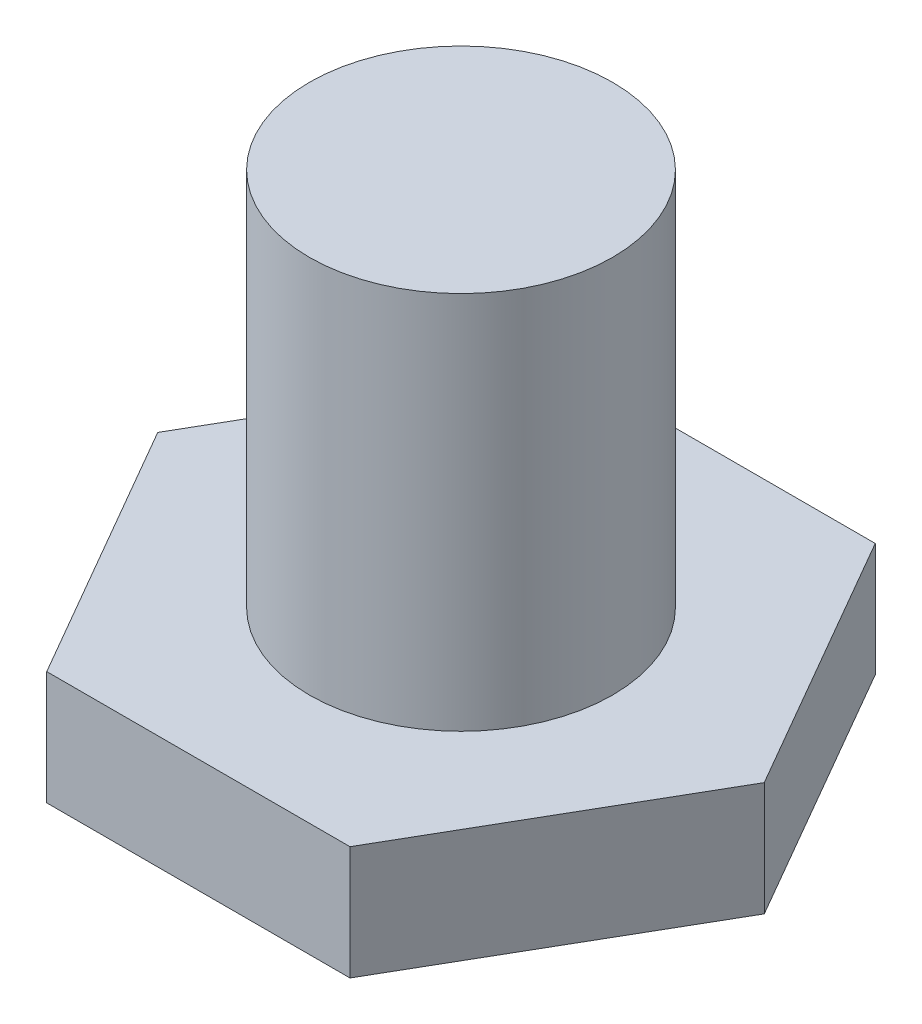
ISO-10303-21;
HEADER;
FILE_DESCRIPTION(('STEP AP214'),'2;1');
FILE_NAME('part.step','',(''),(''),'','','');
FILE_SCHEMA(('AUTOMOTIVE_DESIGN { 1 0 10303 214 1 1 1 1 }'));
ENDSEC;
DATA;
#1=APPLICATION_CONTEXT('core data for automotive mechanical design processes');
#2=APPLICATION_PROTOCOL_DEFINITION('international standard','automotive_design',2000,#1);
#3=PRODUCT_CONTEXT('',#1,'mechanical');
#4=PRODUCT('Part','Part','',(#3));
#5=PRODUCT_RELATED_PRODUCT_CATEGORY('part','',(#4));
#6=PRODUCT_DEFINITION_FORMATION('','',#4);
#7=PRODUCT_DEFINITION_CONTEXT('part definition',#1,'design');
#8=PRODUCT_DEFINITION('design','',#6,#7);
#9=PRODUCT_DEFINITION_SHAPE('','',#8);
#10=(LENGTH_UNIT() NAMED_UNIT(*) SI_UNIT(.MILLI.,.METRE.));
#11=(NAMED_UNIT(*) PLANE_ANGLE_UNIT() SI_UNIT($,.RADIAN.));
#12=(NAMED_UNIT(*) SI_UNIT($,.STERADIAN.) SOLID_ANGLE_UNIT());
#13=UNCERTAINTY_MEASURE_WITH_UNIT(LENGTH_MEASURE(1.E-05),#10,'distance_accuracy_value','');
#14=(GEOMETRIC_REPRESENTATION_CONTEXT(3) GLOBAL_UNCERTAINTY_ASSIGNED_CONTEXT((#13)) GLOBAL_UNIT_ASSIGNED_CONTEXT((#10,
#11,#12)) REPRESENTATION_CONTEXT('',''));
#15=CARTESIAN_POINT('',(0.,0.,0.));
#16=DIRECTION('',(0.,0.,1.));
#17=DIRECTION('',(1.,0.,0.));
#18=AXIS2_PLACEMENT_3D('',#15,#16,#17);
#19=CARTESIAN_POINT('',(2.,1.5,3.46410161513776));
#20=DIRECTION('',(-0.866025403784439,0.,-0.5));
#21=DIRECTION('',(-0.5,0.,0.866025403784439));
#22=AXIS2_PLACEMENT_3D('',#19,#20,#21);
#23=PLANE('',#22);
#24=DIRECTION('',(0.5,0.,-0.866025403784439));
#25=VECTOR('',#24,1.);
#26=CARTESIAN_POINT('',(2.,0.,3.46410161513776));
#27=LINE('',#26,#25);
#28=CARTESIAN_POINT('',(2.,0.,3.46410161513776));
#29=VERTEX_POINT('',#28);
#30=CARTESIAN_POINT('',(4.,0.,0.));
#31=VERTEX_POINT('',#30);
#32=EDGE_CURVE('E136',#29,#31,#27,.T.);
#33=ORIENTED_EDGE('',*,*,#32,.T.);
#34=DIRECTION('',(0.,-1.,0.));
#35=VECTOR('',#34,1.);
#36=CARTESIAN_POINT('',(4.,1.5,0.));
#37=LINE('',#36,#35);
#38=CARTESIAN_POINT('',(4.,1.5,0.));
#39=VERTEX_POINT('',#38);
#40=EDGE_CURVE('E48',#39,#31,#37,.T.);
#41=ORIENTED_EDGE('',*,*,#40,.F.);
#42=DIRECTION('',(0.5,0.,-0.866025403784439));
#43=VECTOR('',#42,1.);
#44=CARTESIAN_POINT('',(2.,1.5,3.46410161513776));
#45=LINE('',#44,#43);
#46=CARTESIAN_POINT('',(2.,1.5,3.46410161513776));
#47=VERTEX_POINT('',#46);
#48=EDGE_CURVE('E153',#47,#39,#45,.T.);
#49=ORIENTED_EDGE('',*,*,#48,.F.);
#50=DIRECTION('',(0.,-1.,0.));
#51=VECTOR('',#50,1.);
#52=CARTESIAN_POINT('',(2.,1.5,3.46410161513776));
#53=LINE('',#52,#51);
#54=EDGE_CURVE('E134',#47,#29,#53,.T.);
#55=ORIENTED_EDGE('',*,*,#54,.T.);
#56=EDGE_LOOP('',(#33,#41,#49,#55));
#57=FACE_BOUND('',#56,.T.);
#58=ADVANCED_FACE('F44',(#57),#23,.F.);
#59=CARTESIAN_POINT('',(4.,1.5,0.));
#60=DIRECTION('',(-0.866025403784438,0.,0.5));
#61=DIRECTION('',(0.5,0.,0.866025403784439));
#62=AXIS2_PLACEMENT_3D('',#59,#60,#61);
#63=PLANE('',#62);
#64=DIRECTION('',(-0.5,0.,-0.866025403784439));
#65=VECTOR('',#64,1.);
#66=CARTESIAN_POINT('',(4.,0.,0.));
#67=LINE('',#66,#65);
#68=CARTESIAN_POINT('',(2.,0.,-3.46410161513776));
#69=VERTEX_POINT('',#68);
#70=EDGE_CURVE('E139',#31,#69,#67,.T.);
#71=ORIENTED_EDGE('',*,*,#70,.T.);
#72=DIRECTION('',(0.,-1.,0.));
#73=VECTOR('',#72,1.);
#74=CARTESIAN_POINT('',(2.,1.5,-3.46410161513776));
#75=LINE('',#74,#73);
#76=CARTESIAN_POINT('',(2.,1.5,-3.46410161513776));
#77=VERTEX_POINT('',#76);
#78=EDGE_CURVE('E157',#77,#69,#75,.T.);
#79=ORIENTED_EDGE('',*,*,#78,.F.);
#80=DIRECTION('',(-0.5,0.,-0.866025403784439));
#81=VECTOR('',#80,1.);
#82=CARTESIAN_POINT('',(4.,1.5,0.));
#83=LINE('',#82,#81);
#84=EDGE_CURVE('E101',#39,#77,#83,.T.);
#85=ORIENTED_EDGE('',*,*,#84,.F.);
#86=ORIENTED_EDGE('',*,*,#40,.T.);
#87=EDGE_LOOP('',(#71,#79,#85,#86));
#88=FACE_BOUND('',#87,.T.);
#89=ADVANCED_FACE('F167',(#88),#63,.F.);
#90=CARTESIAN_POINT('',(2.,1.5,-3.46410161513776));
#91=DIRECTION('',(0.,0.,1.));
#92=DIRECTION('',(1.,0.,0.));
#93=AXIS2_PLACEMENT_3D('',#90,#91,#92);
#94=PLANE('',#93);
#95=DIRECTION('',(-1.,0.,0.));
#96=VECTOR('',#95,1.);
#97=CARTESIAN_POINT('',(2.,0.,-3.46410161513776));
#98=LINE('',#97,#96);
#99=CARTESIAN_POINT('',(-2.,0.,-3.46410161513776));
#100=VERTEX_POINT('',#99);
#101=EDGE_CURVE('E145',#69,#100,#98,.T.);
#102=ORIENTED_EDGE('',*,*,#101,.T.);
#103=DIRECTION('',(0.,-1.,0.));
#104=VECTOR('',#103,1.);
#105=CARTESIAN_POINT('',(-2.,1.5,-3.46410161513776));
#106=LINE('',#105,#104);
#107=CARTESIAN_POINT('',(-2.,1.5,-3.46410161513776));
#108=VERTEX_POINT('',#107);
#109=EDGE_CURVE('E124',#108,#100,#106,.T.);
#110=ORIENTED_EDGE('',*,*,#109,.F.);
#111=DIRECTION('',(-1.,0.,0.));
#112=VECTOR('',#111,1.);
#113=CARTESIAN_POINT('',(2.,1.5,-3.46410161513776));
#114=LINE('',#113,#112);
#115=EDGE_CURVE('E111',#77,#108,#114,.T.);
#116=ORIENTED_EDGE('',*,*,#115,.F.);
#117=ORIENTED_EDGE('',*,*,#78,.T.);
#118=EDGE_LOOP('',(#102,#110,#116,#117));
#119=FACE_BOUND('',#118,.T.);
#120=ADVANCED_FACE('F174',(#119),#94,.F.);
#121=CARTESIAN_POINT('',(-2.,1.5,-3.46410161513776));
#122=DIRECTION('',(0.866025403784439,0.,0.5));
#123=DIRECTION('',(0.5,0.,-0.866025403784439));
#124=AXIS2_PLACEMENT_3D('',#121,#122,#123);
#125=PLANE('',#124);
#126=DIRECTION('',(-0.5,0.,0.866025403784439));
#127=VECTOR('',#126,1.);
#128=CARTESIAN_POINT('',(-2.,0.,-3.46410161513776));
#129=LINE('',#128,#127);
#130=CARTESIAN_POINT('',(-4.,0.,0.));
#131=VERTEX_POINT('',#130);
#132=EDGE_CURVE('E123',#100,#131,#129,.T.);
#133=ORIENTED_EDGE('',*,*,#132,.T.);
#134=DIRECTION('',(0.,-1.,0.));
#135=VECTOR('',#134,1.);
#136=CARTESIAN_POINT('',(-4.,1.5,0.));
#137=LINE('',#136,#135);
#138=CARTESIAN_POINT('',(-4.,1.5,0.));
#139=VERTEX_POINT('',#138);
#140=EDGE_CURVE('E116',#139,#131,#137,.T.);
#141=ORIENTED_EDGE('',*,*,#140,.F.);
#142=DIRECTION('',(-0.5,0.,0.866025403784439));
#143=VECTOR('',#142,1.);
#144=CARTESIAN_POINT('',(-2.,1.5,-3.46410161513776));
#145=LINE('',#144,#143);
#146=EDGE_CURVE('E107',#108,#139,#145,.T.);
#147=ORIENTED_EDGE('',*,*,#146,.F.);
#148=ORIENTED_EDGE('',*,*,#109,.T.);
#149=EDGE_LOOP('',(#133,#141,#147,#148));
#150=FACE_BOUND('',#149,.T.);
#151=ADVANCED_FACE('F121',(#150),#125,.F.);
#152=CARTESIAN_POINT('',(-4.,1.5,0.));
#153=DIRECTION('',(0.866025403784439,0.,-0.5));
#154=DIRECTION('',(-0.5,0.,-0.866025403784439));
#155=AXIS2_PLACEMENT_3D('',#152,#153,#154);
#156=PLANE('',#155);
#157=DIRECTION('',(0.5,0.,0.866025403784438));
#158=VECTOR('',#157,1.);
#159=CARTESIAN_POINT('',(-4.,0.,0.));
#160=LINE('',#159,#158);
#161=CARTESIAN_POINT('',(-2.,0.,3.46410161513776));
#162=VERTEX_POINT('',#161);
#163=EDGE_CURVE('E88',#131,#162,#160,.T.);
#164=ORIENTED_EDGE('',*,*,#163,.T.);
#165=DIRECTION('',(0.,-1.,0.));
#166=VECTOR('',#165,1.);
#167=CARTESIAN_POINT('',(-2.,1.5,3.46410161513776));
#168=LINE('',#167,#166);
#169=CARTESIAN_POINT('',(-2.,1.5,3.46410161513776));
#170=VERTEX_POINT('',#169);
#171=EDGE_CURVE('E127',#170,#162,#168,.T.);
#172=ORIENTED_EDGE('',*,*,#171,.F.);
#173=DIRECTION('',(0.5,0.,0.866025403784438));
#174=VECTOR('',#173,1.);
#175=CARTESIAN_POINT('',(-4.,1.5,0.));
#176=LINE('',#175,#174);
#177=EDGE_CURVE('E115',#139,#170,#176,.T.);
#178=ORIENTED_EDGE('',*,*,#177,.F.);
#179=ORIENTED_EDGE('',*,*,#140,.T.);
#180=EDGE_LOOP('',(#164,#172,#178,#179));
#181=FACE_BOUND('',#180,.T.);
#182=ADVANCED_FACE('F126',(#181),#156,.F.);
#183=CARTESIAN_POINT('',(-2.,1.5,3.46410161513776));
#184=DIRECTION('',(0.,0.,-1.));
#185=DIRECTION('',(-1.,0.,0.));
#186=AXIS2_PLACEMENT_3D('',#183,#184,#185);
#187=PLANE('',#186);
#188=DIRECTION('',(1.,0.,0.));
#189=VECTOR('',#188,1.);
#190=CARTESIAN_POINT('',(-2.,0.,3.46410161513776));
#191=LINE('',#190,#189);
#192=EDGE_CURVE('E95',#162,#29,#191,.T.);
#193=ORIENTED_EDGE('',*,*,#192,.T.);
#194=ORIENTED_EDGE('',*,*,#54,.F.);
#195=DIRECTION('',(1.,0.,0.));
#196=VECTOR('',#195,1.);
#197=CARTESIAN_POINT('',(-2.,1.5,3.46410161513776));
#198=LINE('',#197,#196);
#199=EDGE_CURVE('E62',#170,#47,#198,.T.);
#200=ORIENTED_EDGE('',*,*,#199,.F.);
#201=ORIENTED_EDGE('',*,*,#171,.T.);
#202=EDGE_LOOP('',(#193,#194,#200,#201));
#203=FACE_BOUND('',#202,.T.);
#204=ADVANCED_FACE('F195',(#203),#187,.F.);
#205=CARTESIAN_POINT('',(0.,1.5,0.));
#206=DIRECTION('',(0.,1.,0.));
#207=DIRECTION('',(0.,0.,1.));
#208=AXIS2_PLACEMENT_3D('',#205,#206,#207);
#209=PLANE('',#208);
#210=CARTESIAN_POINT('',(0.,1.5,0.));
#211=DIRECTION('',(0.,1.,0.));
#212=DIRECTION('',(0.,0.,1.));
#213=AXIS2_PLACEMENT_3D('',#210,#211,#212);
#214=CIRCLE('',#213,2.);
#215=CARTESIAN_POINT('',(0.,1.5,2.));
#216=VERTEX_POINT('',#215);
#217=EDGE_CURVE('E11',#216,#216,#214,.T.);
#218=ORIENTED_EDGE('',*,*,#217,.F.);
#219=EDGE_LOOP('',(#218));
#220=FACE_BOUND('',#219,.T.);
#221=ORIENTED_EDGE('',*,*,#48,.T.);
#222=ORIENTED_EDGE('',*,*,#84,.T.);
#223=ORIENTED_EDGE('',*,*,#115,.T.);
#224=ORIENTED_EDGE('',*,*,#146,.T.);
#225=ORIENTED_EDGE('',*,*,#177,.T.);
#226=ORIENTED_EDGE('',*,*,#199,.T.);
#227=EDGE_LOOP('',(#221,#222,#223,#224,#225,#226));
#228=FACE_BOUND('',#227,.T.);
#229=ADVANCED_FACE('F109',(#220,#228),#209,.T.);
#230=CARTESIAN_POINT('',(0.,0.,0.));
#231=DIRECTION('',(0.,1.,0.));
#232=DIRECTION('',(0.,0.,1.));
#233=AXIS2_PLACEMENT_3D('',#230,#231,#232);
#234=PLANE('',#233);
#235=ORIENTED_EDGE('',*,*,#32,.F.);
#236=ORIENTED_EDGE('',*,*,#192,.F.);
#237=ORIENTED_EDGE('',*,*,#163,.F.);
#238=ORIENTED_EDGE('',*,*,#132,.F.);
#239=ORIENTED_EDGE('',*,*,#101,.F.);
#240=ORIENTED_EDGE('',*,*,#70,.F.);
#241=EDGE_LOOP('',(#235,#236,#237,#238,#239,#240));
#242=FACE_BOUND('',#241,.T.);
#243=ADVANCED_FACE('F173',(#242),#234,.F.);
#244=CARTESIAN_POINT('',(0.,6.5,0.));
#245=DIRECTION('',(0.,-1.,0.));
#246=DIRECTION('',(0.,0.,-1.));
#247=AXIS2_PLACEMENT_3D('',#244,#245,#246);
#248=CYLINDRICAL_SURFACE('',#247,2.);
#249=CARTESIAN_POINT('',(0.,6.5,0.));
#250=DIRECTION('',(0.,1.,0.));
#251=DIRECTION('',(0.,0.,1.));
#252=AXIS2_PLACEMENT_3D('',#249,#250,#251);
#253=CIRCLE('',#252,2.);
#254=CARTESIAN_POINT('',(0.,6.5,2.));
#255=VERTEX_POINT('',#254);
#256=EDGE_CURVE('E143',#255,#255,#253,.T.);
#257=ORIENTED_EDGE('',*,*,#256,.F.);
#258=EDGE_LOOP('',(#257));
#259=FACE_BOUND('',#258,.T.);
#260=ORIENTED_EDGE('',*,*,#217,.T.);
#261=EDGE_LOOP('',(#260));
#262=FACE_BOUND('',#261,.T.);
#263=ADVANCED_FACE('F183',(#259,#262),#248,.T.);
#264=CARTESIAN_POINT('',(0.,6.5,0.));
#265=DIRECTION('',(0.,1.,0.));
#266=DIRECTION('',(0.,0.,1.));
#267=AXIS2_PLACEMENT_3D('',#264,#265,#266);
#268=PLANE('',#267);
#269=ORIENTED_EDGE('',*,*,#256,.T.);
#270=EDGE_LOOP('',(#269));
#271=FACE_BOUND('',#270,.T.);
#272=ADVANCED_FACE('F181',(#271),#268,.T.);
#273=CLOSED_SHELL('',(#58,#89,#120,#151,#182,#204,#229,#243,#263,#272));
#274=MANIFOLD_SOLID_BREP('B2',#273);
#275=ADVANCED_BREP_SHAPE_REPRESENTATION('',(#18,#274),#14);
#276=SHAPE_DEFINITION_REPRESENTATION(#9,#275);
ENDSEC;
END-ISO-10303-21;
